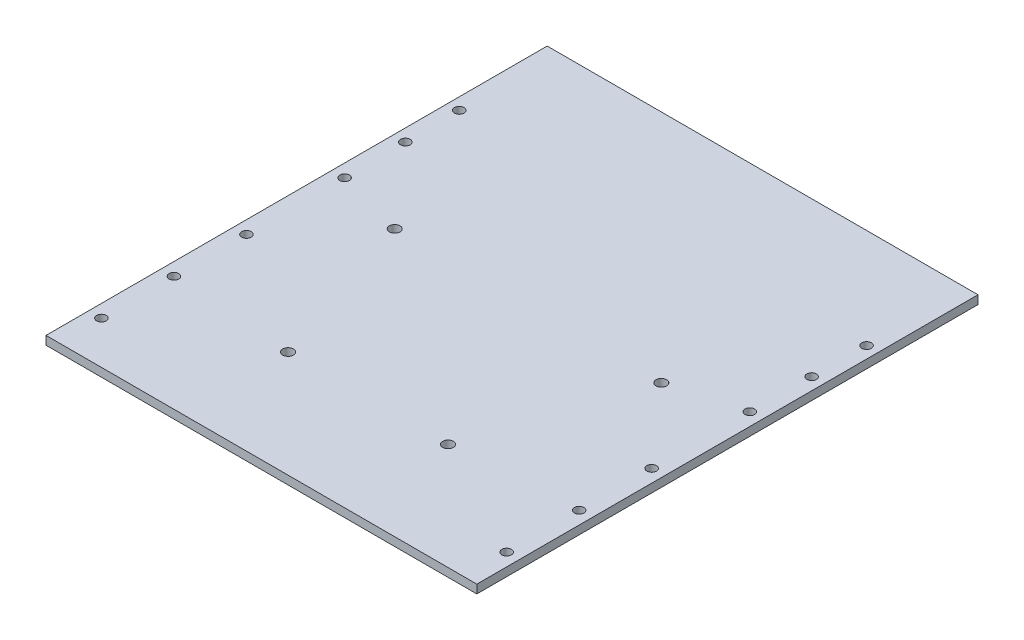
ISO-10303-21;
HEADER;
FILE_DESCRIPTION(('STEP AP214'),'2;1');
FILE_NAME('part.step','',(''),(''),'','','');
FILE_SCHEMA(('AUTOMOTIVE_DESIGN { 1 0 10303 214 1 1 1 1 }'));
ENDSEC;
DATA;
#1=APPLICATION_CONTEXT('core data for automotive mechanical design processes');
#2=APPLICATION_PROTOCOL_DEFINITION('international standard','automotive_design',2000,#1);
#3=PRODUCT_CONTEXT('',#1,'mechanical');
#4=PRODUCT('Part','Part','',(#3));
#5=PRODUCT_RELATED_PRODUCT_CATEGORY('part','',(#4));
#6=PRODUCT_DEFINITION_FORMATION('','',#4);
#7=PRODUCT_DEFINITION_CONTEXT('part definition',#1,'design');
#8=PRODUCT_DEFINITION('design','',#6,#7);
#9=PRODUCT_DEFINITION_SHAPE('','',#8);
#10=(LENGTH_UNIT() NAMED_UNIT(*) SI_UNIT(.MILLI.,.METRE.));
#11=(NAMED_UNIT(*) PLANE_ANGLE_UNIT() SI_UNIT($,.RADIAN.));
#12=(NAMED_UNIT(*) SI_UNIT($,.STERADIAN.) SOLID_ANGLE_UNIT());
#13=UNCERTAINTY_MEASURE_WITH_UNIT(LENGTH_MEASURE(1.E-05),#10,'distance_accuracy_value','');
#14=(GEOMETRIC_REPRESENTATION_CONTEXT(3) GLOBAL_UNCERTAINTY_ASSIGNED_CONTEXT((#13)) GLOBAL_UNIT_ASSIGNED_CONTEXT((#10,
#11,#12)) REPRESENTATION_CONTEXT('',''));
#15=CARTESIAN_POINT('',(0.,0.,0.));
#16=DIRECTION('',(0.,0.,1.));
#17=DIRECTION('',(1.,0.,0.));
#18=AXIS2_PLACEMENT_3D('',#15,#16,#17);
#19=CARTESIAN_POINT('',(0.,8.,-470.));
#20=DIRECTION('',(0.,0.,-1.));
#21=DIRECTION('',(-1.,0.,0.));
#22=AXIS2_PLACEMENT_3D('',#19,#20,#21);
#23=PLANE('',#22);
#24=DIRECTION('',(1.,0.,0.));
#25=VECTOR('',#24,1.);
#26=CARTESIAN_POINT('',(0.,0.,-470.));
#27=LINE('',#26,#25);
#28=CARTESIAN_POINT('',(0.,0.,-470.));
#29=VERTEX_POINT('',#28);
#30=CARTESIAN_POINT('',(404.,0.,-470.));
#31=VERTEX_POINT('',#30);
#32=EDGE_CURVE('E110',#29,#31,#27,.T.);
#33=ORIENTED_EDGE('',*,*,#32,.F.);
#34=DIRECTION('',(0.,-1.,0.));
#35=VECTOR('',#34,1.);
#36=CARTESIAN_POINT('',(0.,8.,-470.));
#37=LINE('',#36,#35);
#38=CARTESIAN_POINT('',(0.,8.,-470.));
#39=VERTEX_POINT('',#38);
#40=EDGE_CURVE('E11',#39,#29,#37,.T.);
#41=ORIENTED_EDGE('',*,*,#40,.F.);
#42=DIRECTION('',(1.,0.,0.));
#43=VECTOR('',#42,1.);
#44=CARTESIAN_POINT('',(0.,8.,-470.));
#45=LINE('',#44,#43);
#46=CARTESIAN_POINT('',(404.,8.,-470.));
#47=VERTEX_POINT('',#46);
#48=EDGE_CURVE('E101',#39,#47,#45,.T.);
#49=ORIENTED_EDGE('',*,*,#48,.T.);
#50=DIRECTION('',(0.,-1.,0.));
#51=VECTOR('',#50,1.);
#52=CARTESIAN_POINT('',(404.,8.,-470.));
#53=LINE('',#52,#51);
#54=EDGE_CURVE('E42',#47,#31,#53,.T.);
#55=ORIENTED_EDGE('',*,*,#54,.T.);
#56=EDGE_LOOP('',(#33,#41,#49,#55));
#57=FACE_BOUND('',#56,.T.);
#58=ADVANCED_FACE('F39',(#57),#23,.T.);
#59=CARTESIAN_POINT('',(0.,8.,0.));
#60=DIRECTION('',(-1.,0.,0.));
#61=DIRECTION('',(0.,0.,1.));
#62=AXIS2_PLACEMENT_3D('',#59,#60,#61);
#63=PLANE('',#62);
#64=DIRECTION('',(0.,0.,-1.));
#65=VECTOR('',#64,1.);
#66=CARTESIAN_POINT('',(0.,0.,0.));
#67=LINE('',#66,#65);
#68=CARTESIAN_POINT('',(0.,0.,0.));
#69=VERTEX_POINT('',#68);
#70=EDGE_CURVE('E104',#69,#29,#67,.T.);
#71=ORIENTED_EDGE('',*,*,#70,.F.);
#72=DIRECTION('',(0.,-1.,0.));
#73=VECTOR('',#72,1.);
#74=CARTESIAN_POINT('',(0.,8.,0.));
#75=LINE('',#74,#73);
#76=CARTESIAN_POINT('',(0.,8.,0.));
#77=VERTEX_POINT('',#76);
#78=EDGE_CURVE('E49',#77,#69,#75,.T.);
#79=ORIENTED_EDGE('',*,*,#78,.F.);
#80=DIRECTION('',(0.,0.,-1.));
#81=VECTOR('',#80,1.);
#82=CARTESIAN_POINT('',(0.,8.,0.));
#83=LINE('',#82,#81);
#84=EDGE_CURVE('E88',#77,#39,#83,.T.);
#85=ORIENTED_EDGE('',*,*,#84,.T.);
#86=ORIENTED_EDGE('',*,*,#40,.T.);
#87=EDGE_LOOP('',(#71,#79,#85,#86));
#88=FACE_BOUND('',#87,.T.);
#89=ADVANCED_FACE('F127',(#88),#63,.T.);
#90=CARTESIAN_POINT('',(0.,8.,0.));
#91=DIRECTION('',(0.,0.,-1.));
#92=DIRECTION('',(-1.,0.,0.));
#93=AXIS2_PLACEMENT_3D('',#90,#91,#92);
#94=PLANE('',#93);
#95=DIRECTION('',(1.,0.,0.));
#96=VECTOR('',#95,1.);
#97=CARTESIAN_POINT('',(0.,0.,0.));
#98=LINE('',#97,#96);
#99=CARTESIAN_POINT('',(404.,0.,0.));
#100=VERTEX_POINT('',#99);
#101=EDGE_CURVE('E94',#69,#100,#98,.T.);
#102=ORIENTED_EDGE('',*,*,#101,.T.);
#103=DIRECTION('',(0.,-1.,0.));
#104=VECTOR('',#103,1.);
#105=CARTESIAN_POINT('',(404.,8.,0.));
#106=LINE('',#105,#104);
#107=CARTESIAN_POINT('',(404.,8.,0.));
#108=VERTEX_POINT('',#107);
#109=EDGE_CURVE('E92',#108,#100,#106,.T.);
#110=ORIENTED_EDGE('',*,*,#109,.F.);
#111=DIRECTION('',(1.,0.,0.));
#112=VECTOR('',#111,1.);
#113=CARTESIAN_POINT('',(0.,8.,0.));
#114=LINE('',#113,#112);
#115=EDGE_CURVE('E85',#77,#108,#114,.T.);
#116=ORIENTED_EDGE('',*,*,#115,.F.);
#117=ORIENTED_EDGE('',*,*,#78,.T.);
#118=EDGE_LOOP('',(#102,#110,#116,#117));
#119=FACE_BOUND('',#118,.T.);
#120=ADVANCED_FACE('F93',(#119),#94,.F.);
#121=CARTESIAN_POINT('',(404.,8.,0.));
#122=DIRECTION('',(-1.,0.,0.));
#123=DIRECTION('',(0.,0.,1.));
#124=AXIS2_PLACEMENT_3D('',#121,#122,#123);
#125=PLANE('',#124);
#126=DIRECTION('',(0.,0.,-1.));
#127=VECTOR('',#126,1.);
#128=CARTESIAN_POINT('',(404.,0.,0.));
#129=LINE('',#128,#127);
#130=EDGE_CURVE('E114',#100,#31,#129,.T.);
#131=ORIENTED_EDGE('',*,*,#130,.T.);
#132=ORIENTED_EDGE('',*,*,#54,.F.);
#133=DIRECTION('',(0.,0.,-1.));
#134=VECTOR('',#133,1.);
#135=CARTESIAN_POINT('',(404.,8.,0.));
#136=LINE('',#135,#134);
#137=EDGE_CURVE('E82',#108,#47,#136,.T.);
#138=ORIENTED_EDGE('',*,*,#137,.F.);
#139=ORIENTED_EDGE('',*,*,#109,.T.);
#140=EDGE_LOOP('',(#131,#132,#138,#139));
#141=FACE_BOUND('',#140,.T.);
#142=ADVANCED_FACE('F99',(#141),#125,.F.);
#143=CARTESIAN_POINT('',(0.,8.,0.));
#144=DIRECTION('',(0.,1.,0.));
#145=DIRECTION('',(0.,0.,1.));
#146=AXIS2_PLACEMENT_3D('',#143,#144,#145);
#147=PLANE('',#146);
#148=CARTESIAN_POINT('',(11.,8.,-376.5));
#149=DIRECTION('',(0.,1.,0.));
#150=DIRECTION('',(0.,0.,1.));
#151=AXIS2_PLACEMENT_3D('',#148,#149,#150);
#152=CIRCLE('',#151,4.5);
#153=CARTESIAN_POINT('',(11.,8.,-372.));
#154=VERTEX_POINT('',#153);
#155=EDGE_CURVE('E297',#154,#154,#152,.T.);
#156=ORIENTED_EDGE('',*,*,#155,.F.);
#157=EDGE_LOOP('',(#156));
#158=FACE_BOUND('',#157,.T.);
#159=CARTESIAN_POINT('',(392.,8.,-40.));
#160=DIRECTION('',(0.,1.,0.));
#161=DIRECTION('',(0.,0.,-1.));
#162=AXIS2_PLACEMENT_3D('',#159,#160,#161);
#163=CIRCLE('',#162,4.50000000000002);
#164=CARTESIAN_POINT('',(392.,8.,-44.5));
#165=VERTEX_POINT('',#164);
#166=EDGE_CURVE('E280',#165,#165,#163,.T.);
#167=ORIENTED_EDGE('',*,*,#166,.F.);
#168=EDGE_LOOP('',(#167));
#169=FACE_BOUND('',#168,.T.);
#170=CARTESIAN_POINT('',(392.,8.,-108.));
#171=DIRECTION('',(0.,1.,0.));
#172=DIRECTION('',(0.,0.,-1.));
#173=AXIS2_PLACEMENT_3D('',#170,#171,#172);
#174=CIRCLE('',#173,4.50000000000002);
#175=CARTESIAN_POINT('',(392.,8.,-112.5));
#176=VERTEX_POINT('',#175);
#177=EDGE_CURVE('E281',#176,#176,#174,.T.);
#178=ORIENTED_EDGE('',*,*,#177,.F.);
#179=EDGE_LOOP('',(#178));
#180=FACE_BOUND('',#179,.T.);
#181=CARTESIAN_POINT('',(392.,8.,-176.));
#182=DIRECTION('',(0.,1.,0.));
#183=DIRECTION('',(0.,0.,-1.));
#184=AXIS2_PLACEMENT_3D('',#181,#182,#183);
#185=CIRCLE('',#184,4.50000000000002);
#186=CARTESIAN_POINT('',(392.,8.,-180.5));
#187=VERTEX_POINT('',#186);
#188=EDGE_CURVE('E264',#187,#187,#185,.T.);
#189=ORIENTED_EDGE('',*,*,#188,.F.);
#190=EDGE_LOOP('',(#189));
#191=FACE_BOUND('',#190,.T.);
#192=CARTESIAN_POINT('',(11.5,8.,-325.5));
#193=DIRECTION('',(0.,1.,0.));
#194=DIRECTION('',(0.,0.,1.));
#195=AXIS2_PLACEMENT_3D('',#192,#193,#194);
#196=CIRCLE('',#195,4.5);
#197=CARTESIAN_POINT('',(11.5,8.,-321.));
#198=VERTEX_POINT('',#197);
#199=EDGE_CURVE('E296',#198,#198,#196,.T.);
#200=ORIENTED_EDGE('',*,*,#199,.F.);
#201=EDGE_LOOP('',(#200));
#202=FACE_BOUND('',#201,.T.);
#203=CARTESIAN_POINT('',(12.,8.,-268.));
#204=DIRECTION('',(0.,1.,0.));
#205=DIRECTION('',(0.,0.,1.));
#206=AXIS2_PLACEMENT_3D('',#203,#204,#205);
#207=CIRCLE('',#206,4.5);
#208=CARTESIAN_POINT('',(12.,8.,-263.5));
#209=VERTEX_POINT('',#208);
#210=EDGE_CURVE('E329',#209,#209,#207,.T.);
#211=ORIENTED_EDGE('',*,*,#210,.F.);
#212=EDGE_LOOP('',(#211));
#213=FACE_BOUND('',#212,.T.);
#214=CARTESIAN_POINT('',(12.,8.,-108.));
#215=DIRECTION('',(0.,1.,0.));
#216=DIRECTION('',(0.,0.,1.));
#217=AXIS2_PLACEMENT_3D('',#214,#215,#216);
#218=CIRCLE('',#217,4.5);
#219=CARTESIAN_POINT('',(12.,8.,-103.5));
#220=VERTEX_POINT('',#219);
#221=EDGE_CURVE('E321',#220,#220,#218,.T.);
#222=ORIENTED_EDGE('',*,*,#221,.F.);
#223=EDGE_LOOP('',(#222));
#224=FACE_BOUND('',#223,.T.);
#225=CARTESIAN_POINT('',(12.,8.,-176.));
#226=DIRECTION('',(0.,1.,0.));
#227=DIRECTION('',(0.,0.,1.));
#228=AXIS2_PLACEMENT_3D('',#225,#226,#227);
#229=CIRCLE('',#228,4.5);
#230=CARTESIAN_POINT('',(12.,8.,-171.5));
#231=VERTEX_POINT('',#230);
#232=EDGE_CURVE('E313',#231,#231,#229,.T.);
#233=ORIENTED_EDGE('',*,*,#232,.F.);
#234=EDGE_LOOP('',(#233));
#235=FACE_BOUND('',#234,.T.);
#236=CARTESIAN_POINT('',(327.,8.,-250.));
#237=DIRECTION('',(0.,1.,0.));
#238=DIRECTION('',(0.,0.,1.));
#239=AXIS2_PLACEMENT_3D('',#236,#237,#238);
#240=CIRCLE('',#239,4.99999999999999);
#241=CARTESIAN_POINT('',(327.,8.,-245.));
#242=VERTEX_POINT('',#241);
#243=EDGE_CURVE('E240',#242,#242,#240,.T.);
#244=ORIENTED_EDGE('',*,*,#243,.F.);
#245=EDGE_LOOP('',(#244));
#246=FACE_BOUND('',#245,.T.);
#247=CARTESIAN_POINT('',(77.,8.,-250.));
#248=DIRECTION('',(0.,1.,0.));
#249=DIRECTION('',(0.,0.,1.));
#250=AXIS2_PLACEMENT_3D('',#247,#248,#249);
#251=CIRCLE('',#250,5.00000000000001);
#252=CARTESIAN_POINT('',(77.,8.,-245.));
#253=VERTEX_POINT('',#252);
#254=EDGE_CURVE('E230',#253,#253,#251,.T.);
#255=ORIENTED_EDGE('',*,*,#254,.F.);
#256=EDGE_LOOP('',(#255));
#257=FACE_BOUND('',#256,.T.);
#258=CARTESIAN_POINT('',(277.,8.,-100.));
#259=DIRECTION('',(0.,1.,0.));
#260=DIRECTION('',(0.,0.,1.));
#261=AXIS2_PLACEMENT_3D('',#258,#259,#260);
#262=CIRCLE('',#261,4.99999999999999);
#263=CARTESIAN_POINT('',(277.,8.,-95.));
#264=VERTEX_POINT('',#263);
#265=EDGE_CURVE('E220',#264,#264,#262,.T.);
#266=ORIENTED_EDGE('',*,*,#265,.F.);
#267=EDGE_LOOP('',(#266));
#268=FACE_BOUND('',#267,.T.);
#269=CARTESIAN_POINT('',(392.,8.,-268.));
#270=DIRECTION('',(0.,1.,0.));
#271=DIRECTION('',(0.,0.,-1.));
#272=AXIS2_PLACEMENT_3D('',#269,#270,#271);
#273=CIRCLE('',#272,4.50000000000002);
#274=CARTESIAN_POINT('',(392.,8.,-272.5));
#275=VERTEX_POINT('',#274);
#276=EDGE_CURVE('E265',#275,#275,#273,.T.);
#277=ORIENTED_EDGE('',*,*,#276,.F.);
#278=EDGE_LOOP('',(#277));
#279=FACE_BOUND('',#278,.T.);
#280=CARTESIAN_POINT('',(392.5,8.,-325.5));
#281=DIRECTION('',(0.,1.,0.));
#282=DIRECTION('',(0.,0.,-1.));
#283=AXIS2_PLACEMENT_3D('',#280,#281,#282);
#284=CIRCLE('',#283,4.50000000000002);
#285=CARTESIAN_POINT('',(392.5,8.,-330.));
#286=VERTEX_POINT('',#285);
#287=EDGE_CURVE('E248',#286,#286,#284,.T.);
#288=ORIENTED_EDGE('',*,*,#287,.F.);
#289=EDGE_LOOP('',(#288));
#290=FACE_BOUND('',#289,.T.);
#291=CARTESIAN_POINT('',(393.,8.,-376.5));
#292=DIRECTION('',(0.,1.,0.));
#293=DIRECTION('',(0.,0.,-1.));
#294=AXIS2_PLACEMENT_3D('',#291,#292,#293);
#295=CIRCLE('',#294,4.50000000000002);
#296=CARTESIAN_POINT('',(393.,8.,-381.));
#297=VERTEX_POINT('',#296);
#298=EDGE_CURVE('E249',#297,#297,#295,.T.);
#299=ORIENTED_EDGE('',*,*,#298,.F.);
#300=EDGE_LOOP('',(#299));
#301=FACE_BOUND('',#300,.T.);
#302=CARTESIAN_POINT('',(127.,8.,-100.));
#303=DIRECTION('',(0.,1.,0.));
#304=DIRECTION('',(0.,0.,1.));
#305=AXIS2_PLACEMENT_3D('',#302,#303,#304);
#306=CIRCLE('',#305,4.99999999999999);
#307=CARTESIAN_POINT('',(127.,8.,-95.));
#308=VERTEX_POINT('',#307);
#309=EDGE_CURVE('E227',#308,#308,#306,.T.);
#310=ORIENTED_EDGE('',*,*,#309,.F.);
#311=EDGE_LOOP('',(#310));
#312=FACE_BOUND('',#311,.T.);
#313=CARTESIAN_POINT('',(12.,8.,-40.));
#314=DIRECTION('',(0.,1.,0.));
#315=DIRECTION('',(0.,0.,1.));
#316=AXIS2_PLACEMENT_3D('',#313,#314,#315);
#317=CIRCLE('',#316,4.5);
#318=CARTESIAN_POINT('',(12.,8.,-35.5));
#319=VERTEX_POINT('',#318);
#320=EDGE_CURVE('E312',#319,#319,#317,.T.);
#321=ORIENTED_EDGE('',*,*,#320,.F.);
#322=EDGE_LOOP('',(#321));
#323=FACE_BOUND('',#322,.T.);
#324=ORIENTED_EDGE('',*,*,#48,.F.);
#325=ORIENTED_EDGE('',*,*,#84,.F.);
#326=ORIENTED_EDGE('',*,*,#115,.T.);
#327=ORIENTED_EDGE('',*,*,#137,.T.);
#328=EDGE_LOOP('',(#324,#325,#326,#327));
#329=FACE_BOUND('',#328,.T.);
#330=ADVANCED_FACE('F87',(#158,#169,#180,#191,#202,#213,#224,#235,#246,#257,#268,#279,#290,#301,
#312,#323,#329),#147,.T.);
#331=CARTESIAN_POINT('',(0.,0.,0.));
#332=DIRECTION('',(0.,1.,0.));
#333=DIRECTION('',(0.,0.,1.));
#334=AXIS2_PLACEMENT_3D('',#331,#332,#333);
#335=PLANE('',#334);
#336=CARTESIAN_POINT('',(11.,0.,-376.5));
#337=DIRECTION('',(0.,1.,0.));
#338=DIRECTION('',(0.,0.,1.));
#339=AXIS2_PLACEMENT_3D('',#336,#337,#338);
#340=CIRCLE('',#339,4.5);
#341=CARTESIAN_POINT('',(11.,0.,-372.));
#342=VERTEX_POINT('',#341);
#343=EDGE_CURVE('E292',#342,#342,#340,.T.);
#344=ORIENTED_EDGE('',*,*,#343,.T.);
#345=EDGE_LOOP('',(#344));
#346=FACE_BOUND('',#345,.T.);
#347=CARTESIAN_POINT('',(392.,0.,-40.));
#348=DIRECTION('',(0.,1.,0.));
#349=DIRECTION('',(0.,0.,-1.));
#350=AXIS2_PLACEMENT_3D('',#347,#348,#349);
#351=CIRCLE('',#350,4.50000000000002);
#352=CARTESIAN_POINT('',(392.,0.,-44.5));
#353=VERTEX_POINT('',#352);
#354=EDGE_CURVE('E301',#353,#353,#351,.T.);
#355=ORIENTED_EDGE('',*,*,#354,.T.);
#356=EDGE_LOOP('',(#355));
#357=FACE_BOUND('',#356,.T.);
#358=CARTESIAN_POINT('',(392.,0.,-108.));
#359=DIRECTION('',(0.,1.,0.));
#360=DIRECTION('',(0.,0.,-1.));
#361=AXIS2_PLACEMENT_3D('',#358,#359,#360);
#362=CIRCLE('',#361,4.50000000000002);
#363=CARTESIAN_POINT('',(392.,0.,-112.5));
#364=VERTEX_POINT('',#363);
#365=EDGE_CURVE('E276',#364,#364,#362,.T.);
#366=ORIENTED_EDGE('',*,*,#365,.T.);
#367=EDGE_LOOP('',(#366));
#368=FACE_BOUND('',#367,.T.);
#369=CARTESIAN_POINT('',(392.,0.,-176.));
#370=DIRECTION('',(0.,1.,0.));
#371=DIRECTION('',(0.,0.,-1.));
#372=AXIS2_PLACEMENT_3D('',#369,#370,#371);
#373=CIRCLE('',#372,4.50000000000002);
#374=CARTESIAN_POINT('',(392.,0.,-180.5));
#375=VERTEX_POINT('',#374);
#376=EDGE_CURVE('E285',#375,#375,#373,.T.);
#377=ORIENTED_EDGE('',*,*,#376,.T.);
#378=EDGE_LOOP('',(#377));
#379=FACE_BOUND('',#378,.T.);
#380=CARTESIAN_POINT('',(11.5,0.,-325.5));
#381=DIRECTION('',(0.,1.,0.));
#382=DIRECTION('',(0.,0.,1.));
#383=AXIS2_PLACEMENT_3D('',#380,#381,#382);
#384=CIRCLE('',#383,4.5);
#385=CARTESIAN_POINT('',(11.5,0.,-321.));
#386=VERTEX_POINT('',#385);
#387=EDGE_CURVE('E333',#386,#386,#384,.T.);
#388=ORIENTED_EDGE('',*,*,#387,.T.);
#389=EDGE_LOOP('',(#388));
#390=FACE_BOUND('',#389,.T.);
#391=CARTESIAN_POINT('',(12.,0.,-268.));
#392=DIRECTION('',(0.,1.,0.));
#393=DIRECTION('',(0.,0.,1.));
#394=AXIS2_PLACEMENT_3D('',#391,#392,#393);
#395=CIRCLE('',#394,4.5);
#396=CARTESIAN_POINT('',(12.,0.,-263.5));
#397=VERTEX_POINT('',#396);
#398=EDGE_CURVE('E325',#397,#397,#395,.T.);
#399=ORIENTED_EDGE('',*,*,#398,.T.);
#400=EDGE_LOOP('',(#399));
#401=FACE_BOUND('',#400,.T.);
#402=CARTESIAN_POINT('',(12.,0.,-108.));
#403=DIRECTION('',(0.,1.,0.));
#404=DIRECTION('',(0.,0.,1.));
#405=AXIS2_PLACEMENT_3D('',#402,#403,#404);
#406=CIRCLE('',#405,4.5);
#407=CARTESIAN_POINT('',(12.,0.,-103.5));
#408=VERTEX_POINT('',#407);
#409=EDGE_CURVE('E317',#408,#408,#406,.T.);
#410=ORIENTED_EDGE('',*,*,#409,.T.);
#411=EDGE_LOOP('',(#410));
#412=FACE_BOUND('',#411,.T.);
#413=CARTESIAN_POINT('',(12.,0.,-176.));
#414=DIRECTION('',(0.,1.,0.));
#415=DIRECTION('',(0.,0.,1.));
#416=AXIS2_PLACEMENT_3D('',#413,#414,#415);
#417=CIRCLE('',#416,4.5);
#418=CARTESIAN_POINT('',(12.,0.,-171.5));
#419=VERTEX_POINT('',#418);
#420=EDGE_CURVE('E308',#419,#419,#417,.T.);
#421=ORIENTED_EDGE('',*,*,#420,.T.);
#422=EDGE_LOOP('',(#421));
#423=FACE_BOUND('',#422,.T.);
#424=CARTESIAN_POINT('',(327.,0.,-250.));
#425=DIRECTION('',(0.,1.,0.));
#426=DIRECTION('',(0.,0.,1.));
#427=AXIS2_PLACEMENT_3D('',#424,#425,#426);
#428=CIRCLE('',#427,4.99999999999999);
#429=CARTESIAN_POINT('',(327.,0.,-245.));
#430=VERTEX_POINT('',#429);
#431=EDGE_CURVE('E236',#430,#430,#428,.T.);
#432=ORIENTED_EDGE('',*,*,#431,.T.);
#433=EDGE_LOOP('',(#432));
#434=FACE_BOUND('',#433,.T.);
#435=CARTESIAN_POINT('',(77.,0.,-250.));
#436=DIRECTION('',(0.,1.,0.));
#437=DIRECTION('',(0.,0.,1.));
#438=AXIS2_PLACEMENT_3D('',#435,#436,#437);
#439=CIRCLE('',#438,5.00000000000001);
#440=CARTESIAN_POINT('',(77.,0.,-245.));
#441=VERTEX_POINT('',#440);
#442=EDGE_CURVE('E223',#441,#441,#439,.T.);
#443=ORIENTED_EDGE('',*,*,#442,.T.);
#444=EDGE_LOOP('',(#443));
#445=FACE_BOUND('',#444,.T.);
#446=CARTESIAN_POINT('',(277.,0.,-100.));
#447=DIRECTION('',(0.,1.,0.));
#448=DIRECTION('',(0.,0.,1.));
#449=AXIS2_PLACEMENT_3D('',#446,#447,#448);
#450=CIRCLE('',#449,4.99999999999999);
#451=CARTESIAN_POINT('',(277.,0.,-95.));
#452=VERTEX_POINT('',#451);
#453=EDGE_CURVE('E217',#452,#452,#450,.T.);
#454=ORIENTED_EDGE('',*,*,#453,.T.);
#455=EDGE_LOOP('',(#454));
#456=FACE_BOUND('',#455,.T.);
#457=CARTESIAN_POINT('',(392.,0.,-268.));
#458=DIRECTION('',(0.,1.,0.));
#459=DIRECTION('',(0.,0.,-1.));
#460=AXIS2_PLACEMENT_3D('',#457,#458,#459);
#461=CIRCLE('',#460,4.50000000000002);
#462=CARTESIAN_POINT('',(392.,0.,-272.5));
#463=VERTEX_POINT('',#462);
#464=EDGE_CURVE('E260',#463,#463,#461,.T.);
#465=ORIENTED_EDGE('',*,*,#464,.T.);
#466=EDGE_LOOP('',(#465));
#467=FACE_BOUND('',#466,.T.);
#468=CARTESIAN_POINT('',(392.5,0.,-325.5));
#469=DIRECTION('',(0.,1.,0.));
#470=DIRECTION('',(0.,0.,-1.));
#471=AXIS2_PLACEMENT_3D('',#468,#469,#470);
#472=CIRCLE('',#471,4.50000000000002);
#473=CARTESIAN_POINT('',(392.5,0.,-330.));
#474=VERTEX_POINT('',#473);
#475=EDGE_CURVE('E269',#474,#474,#472,.T.);
#476=ORIENTED_EDGE('',*,*,#475,.T.);
#477=EDGE_LOOP('',(#476));
#478=FACE_BOUND('',#477,.T.);
#479=CARTESIAN_POINT('',(393.,0.,-376.5));
#480=DIRECTION('',(0.,1.,0.));
#481=DIRECTION('',(0.,0.,-1.));
#482=AXIS2_PLACEMENT_3D('',#479,#480,#481);
#483=CIRCLE('',#482,4.50000000000002);
#484=CARTESIAN_POINT('',(393.,0.,-381.));
#485=VERTEX_POINT('',#484);
#486=EDGE_CURVE('E244',#485,#485,#483,.T.);
#487=ORIENTED_EDGE('',*,*,#486,.T.);
#488=EDGE_LOOP('',(#487));
#489=FACE_BOUND('',#488,.T.);
#490=CARTESIAN_POINT('',(127.,0.,-100.));
#491=DIRECTION('',(0.,1.,0.));
#492=DIRECTION('',(0.,0.,1.));
#493=AXIS2_PLACEMENT_3D('',#490,#491,#492);
#494=CIRCLE('',#493,4.99999999999999);
#495=CARTESIAN_POINT('',(127.,0.,-95.));
#496=VERTEX_POINT('',#495);
#497=EDGE_CURVE('E253',#496,#496,#494,.T.);
#498=ORIENTED_EDGE('',*,*,#497,.T.);
#499=EDGE_LOOP('',(#498));
#500=FACE_BOUND('',#499,.T.);
#501=CARTESIAN_POINT('',(12.,0.,-40.));
#502=DIRECTION('',(0.,1.,0.));
#503=DIRECTION('',(0.,0.,1.));
#504=AXIS2_PLACEMENT_3D('',#501,#502,#503);
#505=CIRCLE('',#504,4.5);
#506=CARTESIAN_POINT('',(12.,0.,-35.5));
#507=VERTEX_POINT('',#506);
#508=EDGE_CURVE('E115',#507,#507,#505,.T.);
#509=ORIENTED_EDGE('',*,*,#508,.T.);
#510=EDGE_LOOP('',(#509));
#511=FACE_BOUND('',#510,.T.);
#512=ORIENTED_EDGE('',*,*,#32,.T.);
#513=ORIENTED_EDGE('',*,*,#130,.F.);
#514=ORIENTED_EDGE('',*,*,#101,.F.);
#515=ORIENTED_EDGE('',*,*,#70,.T.);
#516=EDGE_LOOP('',(#512,#513,#514,#515));
#517=FACE_BOUND('',#516,.T.);
#518=ADVANCED_FACE('F126',(#346,#357,#368,#379,#390,#401,#412,#423,#434,#445,#456,#467,#478,
#489,#500,#511,#517),#335,.F.);
#519=CARTESIAN_POINT('',(12.,0.,-40.));
#520=DIRECTION('',(0.,1.,0.));
#521=DIRECTION('',(0.,0.,1.));
#522=AXIS2_PLACEMENT_3D('',#519,#520,#521);
#523=CYLINDRICAL_SURFACE('',#522,4.5);
#524=ORIENTED_EDGE('',*,*,#508,.F.);
#525=EDGE_LOOP('',(#524));
#526=FACE_BOUND('',#525,.T.);
#527=ORIENTED_EDGE('',*,*,#320,.T.);
#528=EDGE_LOOP('',(#527));
#529=FACE_BOUND('',#528,.T.);
#530=ADVANCED_FACE('F145',(#526,#529),#523,.F.);
#531=CARTESIAN_POINT('',(127.,0.,-100.));
#532=DIRECTION('',(0.,1.,0.));
#533=DIRECTION('',(0.,0.,1.));
#534=AXIS2_PLACEMENT_3D('',#531,#532,#533);
#535=CYLINDRICAL_SURFACE('',#534,4.99999999999999);
#536=ORIENTED_EDGE('',*,*,#497,.F.);
#537=EDGE_LOOP('',(#536));
#538=FACE_BOUND('',#537,.T.);
#539=ORIENTED_EDGE('',*,*,#309,.T.);
#540=EDGE_LOOP('',(#539));
#541=FACE_BOUND('',#540,.T.);
#542=ADVANCED_FACE('F152',(#538,#541),#535,.F.);
#543=CARTESIAN_POINT('',(393.,0.,-376.5));
#544=DIRECTION('',(0.,1.,0.));
#545=DIRECTION('',(0.,0.,1.));
#546=AXIS2_PLACEMENT_3D('',#543,#544,#545);
#547=CYLINDRICAL_SURFACE('',#546,4.50000000000002);
#548=ORIENTED_EDGE('',*,*,#486,.F.);
#549=EDGE_LOOP('',(#548));
#550=FACE_BOUND('',#549,.T.);
#551=ORIENTED_EDGE('',*,*,#298,.T.);
#552=EDGE_LOOP('',(#551));
#553=FACE_BOUND('',#552,.T.);
#554=ADVANCED_FACE('F191',(#550,#553),#547,.F.);
#555=CARTESIAN_POINT('',(392.5,0.,-325.5));
#556=DIRECTION('',(0.,1.,0.));
#557=DIRECTION('',(0.,0.,1.));
#558=AXIS2_PLACEMENT_3D('',#555,#556,#557);
#559=CYLINDRICAL_SURFACE('',#558,4.50000000000002);
#560=ORIENTED_EDGE('',*,*,#475,.F.);
#561=EDGE_LOOP('',(#560));
#562=FACE_BOUND('',#561,.T.);
#563=ORIENTED_EDGE('',*,*,#287,.T.);
#564=EDGE_LOOP('',(#563));
#565=FACE_BOUND('',#564,.T.);
#566=ADVANCED_FACE('F187',(#562,#565),#559,.F.);
#567=CARTESIAN_POINT('',(392.,0.,-268.));
#568=DIRECTION('',(0.,1.,0.));
#569=DIRECTION('',(0.,0.,1.));
#570=AXIS2_PLACEMENT_3D('',#567,#568,#569);
#571=CYLINDRICAL_SURFACE('',#570,4.50000000000002);
#572=ORIENTED_EDGE('',*,*,#464,.F.);
#573=EDGE_LOOP('',(#572));
#574=FACE_BOUND('',#573,.T.);
#575=ORIENTED_EDGE('',*,*,#276,.T.);
#576=EDGE_LOOP('',(#575));
#577=FACE_BOUND('',#576,.T.);
#578=ADVANCED_FACE('F190',(#574,#577),#571,.F.);
#579=CARTESIAN_POINT('',(277.,0.,-100.));
#580=DIRECTION('',(0.,1.,0.));
#581=DIRECTION('',(0.,0.,1.));
#582=AXIS2_PLACEMENT_3D('',#579,#580,#581);
#583=CYLINDRICAL_SURFACE('',#582,4.99999999999999);
#584=ORIENTED_EDGE('',*,*,#453,.F.);
#585=EDGE_LOOP('',(#584));
#586=FACE_BOUND('',#585,.T.);
#587=ORIENTED_EDGE('',*,*,#265,.T.);
#588=EDGE_LOOP('',(#587));
#589=FACE_BOUND('',#588,.T.);
#590=ADVANCED_FACE('F195',(#586,#589),#583,.F.);
#591=CARTESIAN_POINT('',(77.,0.,-250.));
#592=DIRECTION('',(0.,1.,0.));
#593=DIRECTION('',(0.,0.,1.));
#594=AXIS2_PLACEMENT_3D('',#591,#592,#593);
#595=CYLINDRICAL_SURFACE('',#594,5.00000000000001);
#596=ORIENTED_EDGE('',*,*,#442,.F.);
#597=EDGE_LOOP('',(#596));
#598=FACE_BOUND('',#597,.T.);
#599=ORIENTED_EDGE('',*,*,#254,.T.);
#600=EDGE_LOOP('',(#599));
#601=FACE_BOUND('',#600,.T.);
#602=ADVANCED_FACE('F205',(#598,#601),#595,.F.);
#603=CARTESIAN_POINT('',(327.,0.,-250.));
#604=DIRECTION('',(0.,1.,0.));
#605=DIRECTION('',(0.,0.,1.));
#606=AXIS2_PLACEMENT_3D('',#603,#604,#605);
#607=CYLINDRICAL_SURFACE('',#606,4.99999999999999);
#608=ORIENTED_EDGE('',*,*,#431,.F.);
#609=EDGE_LOOP('',(#608));
#610=FACE_BOUND('',#609,.T.);
#611=ORIENTED_EDGE('',*,*,#243,.T.);
#612=EDGE_LOOP('',(#611));
#613=FACE_BOUND('',#612,.T.);
#614=ADVANCED_FACE('F170',(#610,#613),#607,.F.);
#615=CARTESIAN_POINT('',(12.,0.,-176.));
#616=DIRECTION('',(0.,1.,0.));
#617=DIRECTION('',(0.,0.,1.));
#618=AXIS2_PLACEMENT_3D('',#615,#616,#617);
#619=CYLINDRICAL_SURFACE('',#618,4.5);
#620=ORIENTED_EDGE('',*,*,#420,.F.);
#621=EDGE_LOOP('',(#620));
#622=FACE_BOUND('',#621,.T.);
#623=ORIENTED_EDGE('',*,*,#232,.T.);
#624=EDGE_LOOP('',(#623));
#625=FACE_BOUND('',#624,.T.);
#626=ADVANCED_FACE('F166',(#622,#625),#619,.F.);
#627=CARTESIAN_POINT('',(12.,0.,-108.));
#628=DIRECTION('',(0.,1.,0.));
#629=DIRECTION('',(0.,0.,1.));
#630=AXIS2_PLACEMENT_3D('',#627,#628,#629);
#631=CYLINDRICAL_SURFACE('',#630,4.5);
#632=ORIENTED_EDGE('',*,*,#409,.F.);
#633=EDGE_LOOP('',(#632));
#634=FACE_BOUND('',#633,.T.);
#635=ORIENTED_EDGE('',*,*,#221,.T.);
#636=EDGE_LOOP('',(#635));
#637=FACE_BOUND('',#636,.T.);
#638=ADVANCED_FACE('F162',(#634,#637),#631,.F.);
#639=CARTESIAN_POINT('',(12.,0.,-268.));
#640=DIRECTION('',(0.,1.,0.));
#641=DIRECTION('',(0.,0.,1.));
#642=AXIS2_PLACEMENT_3D('',#639,#640,#641);
#643=CYLINDRICAL_SURFACE('',#642,4.5);
#644=ORIENTED_EDGE('',*,*,#398,.F.);
#645=EDGE_LOOP('',(#644));
#646=FACE_BOUND('',#645,.T.);
#647=ORIENTED_EDGE('',*,*,#210,.T.);
#648=EDGE_LOOP('',(#647));
#649=FACE_BOUND('',#648,.T.);
#650=ADVANCED_FACE('F158',(#646,#649),#643,.F.);
#651=CARTESIAN_POINT('',(11.5,0.,-325.5));
#652=DIRECTION('',(0.,1.,0.));
#653=DIRECTION('',(0.,0.,1.));
#654=AXIS2_PLACEMENT_3D('',#651,#652,#653);
#655=CYLINDRICAL_SURFACE('',#654,4.5);
#656=ORIENTED_EDGE('',*,*,#387,.F.);
#657=EDGE_LOOP('',(#656));
#658=FACE_BOUND('',#657,.T.);
#659=ORIENTED_EDGE('',*,*,#199,.T.);
#660=EDGE_LOOP('',(#659));
#661=FACE_BOUND('',#660,.T.);
#662=ADVANCED_FACE('F154',(#658,#661),#655,.F.);
#663=CARTESIAN_POINT('',(392.,0.,-176.));
#664=DIRECTION('',(0.,1.,0.));
#665=DIRECTION('',(0.,0.,1.));
#666=AXIS2_PLACEMENT_3D('',#663,#664,#665);
#667=CYLINDRICAL_SURFACE('',#666,4.50000000000002);
#668=ORIENTED_EDGE('',*,*,#376,.F.);
#669=EDGE_LOOP('',(#668));
#670=FACE_BOUND('',#669,.T.);
#671=ORIENTED_EDGE('',*,*,#188,.T.);
#672=EDGE_LOOP('',(#671));
#673=FACE_BOUND('',#672,.T.);
#674=ADVANCED_FACE('F157',(#670,#673),#667,.F.);
#675=CARTESIAN_POINT('',(392.,0.,-108.));
#676=DIRECTION('',(0.,1.,0.));
#677=DIRECTION('',(0.,0.,1.));
#678=AXIS2_PLACEMENT_3D('',#675,#676,#677);
#679=CYLINDRICAL_SURFACE('',#678,4.50000000000002);
#680=ORIENTED_EDGE('',*,*,#365,.F.);
#681=EDGE_LOOP('',(#680));
#682=FACE_BOUND('',#681,.T.);
#683=ORIENTED_EDGE('',*,*,#177,.T.);
#684=EDGE_LOOP('',(#683));
#685=FACE_BOUND('',#684,.T.);
#686=ADVANCED_FACE('F176',(#682,#685),#679,.F.);
#687=CARTESIAN_POINT('',(392.,0.,-40.));
#688=DIRECTION('',(0.,1.,0.));
#689=DIRECTION('',(0.,0.,1.));
#690=AXIS2_PLACEMENT_3D('',#687,#688,#689);
#691=CYLINDRICAL_SURFACE('',#690,4.50000000000002);
#692=ORIENTED_EDGE('',*,*,#354,.F.);
#693=EDGE_LOOP('',(#692));
#694=FACE_BOUND('',#693,.T.);
#695=ORIENTED_EDGE('',*,*,#166,.T.);
#696=EDGE_LOOP('',(#695));
#697=FACE_BOUND('',#696,.T.);
#698=ADVANCED_FACE('F172',(#694,#697),#691,.F.);
#699=CARTESIAN_POINT('',(11.,0.,-376.5));
#700=DIRECTION('',(0.,1.,0.));
#701=DIRECTION('',(0.,0.,1.));
#702=AXIS2_PLACEMENT_3D('',#699,#700,#701);
#703=CYLINDRICAL_SURFACE('',#702,4.5);
#704=ORIENTED_EDGE('',*,*,#343,.F.);
#705=EDGE_LOOP('',(#704));
#706=FACE_BOUND('',#705,.T.);
#707=ORIENTED_EDGE('',*,*,#155,.T.);
#708=EDGE_LOOP('',(#707));
#709=FACE_BOUND('',#708,.T.);
#710=ADVANCED_FACE('F175',(#706,#709),#703,.F.);
#711=CLOSED_SHELL('',(#58,#89,#120,#142,#330,#518,#530,#542,#554,#566,#578,#590,#602,#614,#626,
#638,#650,#662,#674,#686,#698,#710));
#712=MANIFOLD_SOLID_BREP('B2',#711);
#713=ADVANCED_BREP_SHAPE_REPRESENTATION('',(#18,#712),#14);
#714=SHAPE_DEFINITION_REPRESENTATION(#9,#713);
ENDSEC;
END-ISO-10303-21;
